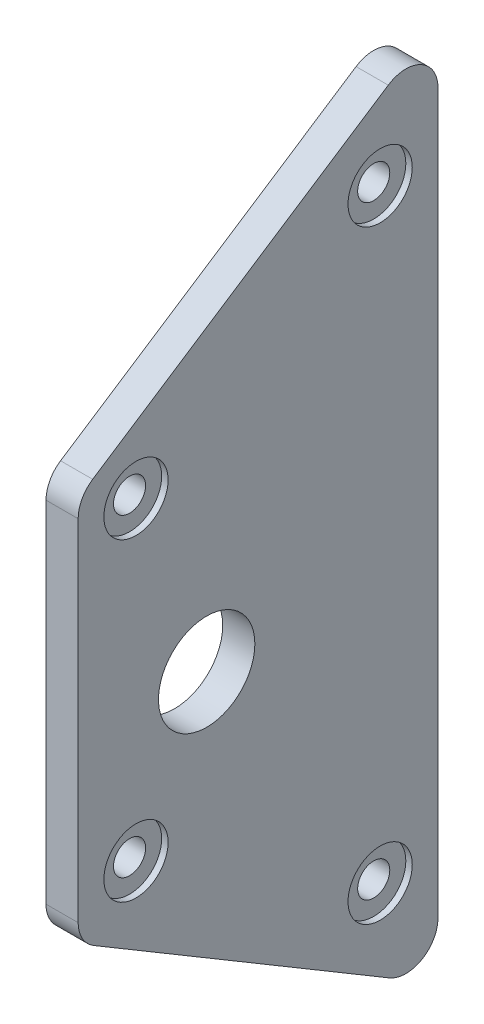
ISO-10303-21;
HEADER;
FILE_DESCRIPTION(('STEP AP214'),'2;1');
FILE_NAME('part.step','',(''),(''),'','','');
FILE_SCHEMA(('AUTOMOTIVE_DESIGN { 1 0 10303 214 1 1 1 1 }'));
ENDSEC;
DATA;
#1=APPLICATION_CONTEXT('core data for automotive mechanical design processes');
#2=APPLICATION_PROTOCOL_DEFINITION('international standard','automotive_design',2000,#1);
#3=PRODUCT_CONTEXT('',#1,'mechanical');
#4=PRODUCT('Part','Part','',(#3));
#5=PRODUCT_RELATED_PRODUCT_CATEGORY('part','',(#4));
#6=PRODUCT_DEFINITION_FORMATION('','',#4);
#7=PRODUCT_DEFINITION_CONTEXT('part definition',#1,'design');
#8=PRODUCT_DEFINITION('design','',#6,#7);
#9=PRODUCT_DEFINITION_SHAPE('','',#8);
#10=(LENGTH_UNIT() NAMED_UNIT(*) SI_UNIT(.MILLI.,.METRE.));
#11=(NAMED_UNIT(*) PLANE_ANGLE_UNIT() SI_UNIT($,.RADIAN.));
#12=(NAMED_UNIT(*) SI_UNIT($,.STERADIAN.) SOLID_ANGLE_UNIT());
#13=UNCERTAINTY_MEASURE_WITH_UNIT(LENGTH_MEASURE(1.E-05),#10,'distance_accuracy_value','');
#14=(GEOMETRIC_REPRESENTATION_CONTEXT(3) GLOBAL_UNCERTAINTY_ASSIGNED_CONTEXT((#13)) GLOBAL_UNIT_ASSIGNED_CONTEXT((#10,
#11,#12)) REPRESENTATION_CONTEXT('',''));
#15=CARTESIAN_POINT('',(0.,0.,0.));
#16=DIRECTION('',(0.,0.,1.));
#17=DIRECTION('',(1.,0.,0.));
#18=AXIS2_PLACEMENT_3D('',#15,#16,#17);
#19=CARTESIAN_POINT('',(6.35,59.69,-29.1194007412953));
#20=DIRECTION('',(-1.,0.,0.));
#21=DIRECTION('',(0.,0.,1.));
#22=AXIS2_PLACEMENT_3D('',#19,#20,#21);
#23=CYLINDRICAL_SURFACE('',#22,3.175);
#24=CARTESIAN_POINT('',(0.,59.69,-29.1194007412953));
#25=DIRECTION('',(1.,0.,0.));
#26=DIRECTION('',(0.,0.,-1.));
#27=AXIS2_PLACEMENT_3D('',#24,#25,#26);
#28=CIRCLE('',#27,3.175);
#29=CARTESIAN_POINT('',(0.,59.69,-32.2944007412953));
#30=VERTEX_POINT('',#29);
#31=EDGE_CURVE('E187',#30,#30,#28,.T.);
#32=ORIENTED_EDGE('',*,*,#31,.F.);
#33=EDGE_LOOP('',(#32));
#34=FACE_BOUND('',#33,.T.);
#35=CARTESIAN_POINT('',(5.08,59.69,-29.1194007412953));
#36=DIRECTION('',(1.,0.,0.));
#37=DIRECTION('',(0.,0.,-1.));
#38=AXIS2_PLACEMENT_3D('',#35,#36,#37);
#39=CIRCLE('',#38,3.175);
#40=CARTESIAN_POINT('',(5.08,59.69,-32.2944007412953));
#41=VERTEX_POINT('',#40);
#42=EDGE_CURVE('E153',#41,#41,#39,.T.);
#43=ORIENTED_EDGE('',*,*,#42,.T.);
#44=EDGE_LOOP('',(#43));
#45=FACE_BOUND('',#44,.T.);
#46=ADVANCED_FACE('F41',(#34,#45),#23,.F.);
#47=CARTESIAN_POINT('',(6.35,30.2927326221276,19.1405992587047));
#48=DIRECTION('',(-1.,0.,0.));
#49=DIRECTION('',(0.,0.,1.));
#50=AXIS2_PLACEMENT_3D('',#47,#48,#49);
#51=CYLINDRICAL_SURFACE('',#50,3.175);
#52=CARTESIAN_POINT('',(0.,30.2927326221276,19.1405992587047));
#53=DIRECTION('',(1.,0.,0.));
#54=DIRECTION('',(0.,0.,-1.));
#55=AXIS2_PLACEMENT_3D('',#52,#53,#54);
#56=CIRCLE('',#55,3.175);
#57=CARTESIAN_POINT('',(0.,30.2927326221276,15.9655992587047));
#58=VERTEX_POINT('',#57);
#59=EDGE_CURVE('E186',#58,#58,#56,.T.);
#60=ORIENTED_EDGE('',*,*,#59,.F.);
#61=EDGE_LOOP('',(#60));
#62=FACE_BOUND('',#61,.T.);
#63=CARTESIAN_POINT('',(5.08,30.2927326221276,19.1405992587047));
#64=DIRECTION('',(1.,0.,0.));
#65=DIRECTION('',(0.,0.,-1.));
#66=AXIS2_PLACEMENT_3D('',#63,#64,#65);
#67=CIRCLE('',#66,3.175);
#68=CARTESIAN_POINT('',(5.08,30.2927326221276,15.9655992587047));
#69=VERTEX_POINT('',#68);
#70=EDGE_CURVE('E147',#69,#69,#67,.T.);
#71=ORIENTED_EDGE('',*,*,#70,.T.);
#72=EDGE_LOOP('',(#71));
#73=FACE_BOUND('',#72,.T.);
#74=ADVANCED_FACE('F263',(#62,#73),#51,.F.);
#75=CARTESIAN_POINT('',(6.35,-59.69,-29.1194007412953));
#76=DIRECTION('',(-1.,0.,0.));
#77=DIRECTION('',(0.,0.,1.));
#78=AXIS2_PLACEMENT_3D('',#75,#76,#77);
#79=CYLINDRICAL_SURFACE('',#78,3.175);
#80=CARTESIAN_POINT('',(0.,-59.69,-29.1194007412953));
#81=DIRECTION('',(1.,0.,0.));
#82=DIRECTION('',(0.,0.,-1.));
#83=AXIS2_PLACEMENT_3D('',#80,#81,#82);
#84=CIRCLE('',#83,3.175);
#85=CARTESIAN_POINT('',(0.,-59.69,-32.2944007412953));
#86=VERTEX_POINT('',#85);
#87=EDGE_CURVE('E200',#86,#86,#84,.T.);
#88=ORIENTED_EDGE('',*,*,#87,.F.);
#89=EDGE_LOOP('',(#88));
#90=FACE_BOUND('',#89,.T.);
#91=CARTESIAN_POINT('',(5.08,-59.69,-29.1194007412953));
#92=DIRECTION('',(1.,0.,0.));
#93=DIRECTION('',(0.,0.,-1.));
#94=AXIS2_PLACEMENT_3D('',#91,#92,#93);
#95=CIRCLE('',#94,3.175);
#96=CARTESIAN_POINT('',(5.08,-59.69,-32.2944007412953));
#97=VERTEX_POINT('',#96);
#98=EDGE_CURVE('E148',#97,#97,#95,.T.);
#99=ORIENTED_EDGE('',*,*,#98,.T.);
#100=EDGE_LOOP('',(#99));
#101=FACE_BOUND('',#100,.T.);
#102=ADVANCED_FACE('F267',(#90,#101),#79,.F.);
#103=CARTESIAN_POINT('',(6.35,-31.75,19.1405992587047));
#104=DIRECTION('',(-1.,0.,0.));
#105=DIRECTION('',(0.,0.,1.));
#106=AXIS2_PLACEMENT_3D('',#103,#104,#105);
#107=CYLINDRICAL_SURFACE('',#106,3.175);
#108=CARTESIAN_POINT('',(0.,-31.75,19.1405992587047));
#109=DIRECTION('',(1.,0.,0.));
#110=DIRECTION('',(0.,0.,-1.));
#111=AXIS2_PLACEMENT_3D('',#108,#109,#110);
#112=CIRCLE('',#111,3.175);
#113=CARTESIAN_POINT('',(0.,-31.75,15.9655992587047));
#114=VERTEX_POINT('',#113);
#115=EDGE_CURVE('E205',#114,#114,#112,.T.);
#116=ORIENTED_EDGE('',*,*,#115,.F.);
#117=EDGE_LOOP('',(#116));
#118=FACE_BOUND('',#117,.T.);
#119=CARTESIAN_POINT('',(5.08,-31.75,19.1405992587047));
#120=DIRECTION('',(1.,0.,0.));
#121=DIRECTION('',(0.,0.,-1.));
#122=AXIS2_PLACEMENT_3D('',#119,#120,#121);
#123=CIRCLE('',#122,3.175);
#124=CARTESIAN_POINT('',(5.08,-31.75,15.9655992587047));
#125=VERTEX_POINT('',#124);
#126=EDGE_CURVE('E141',#125,#125,#123,.T.);
#127=ORIENTED_EDGE('',*,*,#126,.T.);
#128=EDGE_LOOP('',(#127));
#129=FACE_BOUND('',#128,.T.);
#130=ADVANCED_FACE('F239',(#118,#129),#107,.F.);
#131=CARTESIAN_POINT('',(6.35,0.,0.));
#132=DIRECTION('',(1.,0.,0.));
#133=DIRECTION('',(0.,0.,-1.));
#134=AXIS2_PLACEMENT_3D('',#131,#132,#133);
#135=PLANE('',#134);
#136=CARTESIAN_POINT('',(6.35,-59.69,-29.1194007412953));
#137=DIRECTION('',(1.,0.,0.));
#138=DIRECTION('',(0.,0.,-1.));
#139=AXIS2_PLACEMENT_3D('',#136,#137,#138);
#140=CIRCLE('',#139,6.35);
#141=CARTESIAN_POINT('',(6.35,-59.69,-35.4694007412953));
#142=VERTEX_POINT('',#141);
#143=EDGE_CURVE('E218',#142,#142,#140,.T.);
#144=ORIENTED_EDGE('',*,*,#143,.F.);
#145=EDGE_LOOP('',(#144));
#146=FACE_BOUND('',#145,.T.);
#147=CARTESIAN_POINT('',(6.35,-31.75,19.1405992587047));
#148=DIRECTION('',(1.,0.,0.));
#149=DIRECTION('',(0.,0.,-1.));
#150=AXIS2_PLACEMENT_3D('',#147,#148,#149);
#151=CIRCLE('',#150,6.35);
#152=CARTESIAN_POINT('',(6.35,-31.75,12.7905992587047));
#153=VERTEX_POINT('',#152);
#154=EDGE_CURVE('E223',#153,#153,#151,.T.);
#155=ORIENTED_EDGE('',*,*,#154,.F.);
#156=EDGE_LOOP('',(#155));
#157=FACE_BOUND('',#156,.T.);
#158=CARTESIAN_POINT('',(6.35,59.69,-29.1194007412953));
#159=DIRECTION('',(1.,0.,0.));
#160=DIRECTION('',(0.,0.,-1.));
#161=AXIS2_PLACEMENT_3D('',#158,#159,#160);
#162=CIRCLE('',#161,6.35);
#163=CARTESIAN_POINT('',(6.35,59.69,-35.4694007412953));
#164=VERTEX_POINT('',#163);
#165=EDGE_CURVE('E213',#164,#164,#162,.T.);
#166=ORIENTED_EDGE('',*,*,#165,.F.);
#167=EDGE_LOOP('',(#166));
#168=FACE_BOUND('',#167,.T.);
#169=CARTESIAN_POINT('',(6.35,30.2927326221276,19.1405992587047));
#170=DIRECTION('',(1.,0.,0.));
#171=DIRECTION('',(0.,0.,-1.));
#172=AXIS2_PLACEMENT_3D('',#169,#170,#171);
#173=CIRCLE('',#172,6.35);
#174=CARTESIAN_POINT('',(6.35,30.2927326221276,12.7905992587047));
#175=VERTEX_POINT('',#174);
#176=EDGE_CURVE('E209',#175,#175,#173,.T.);
#177=ORIENTED_EDGE('',*,*,#176,.F.);
#178=EDGE_LOOP('',(#177));
#179=FACE_BOUND('',#178,.T.);
#180=DIRECTION('',(0.,-0.511315038372004,-0.859393350878767));
#181=VECTOR('',#180,1.);
#182=CARTESIAN_POINT('',(6.35,-40.2355865921788,30.5705992587047));
#183=LINE('',#182,#181);
#184=CARTESIAN_POINT('',(6.35,-42.081873868296,27.467449752367));
#185=VERTEX_POINT('',#184);
#186=CARTESIAN_POINT('',(6.35,-76.8401420247205,-30.952550247633));
#187=VERTEX_POINT('',#186);
#188=EDGE_CURVE('E192',#185,#187,#183,.T.);
#189=ORIENTED_EDGE('',*,*,#188,.T.);
#190=CARTESIAN_POINT('',(6.35,-71.3829942466404,-34.1994007412952));
#191=DIRECTION('',(1.,0.,0.));
#192=DIRECTION('',(0.,0.,-1.));
#193=AXIS2_PLACEMENT_3D('',#190,#191,#192);
#194=CIRCLE('',#193,6.35);
#195=CARTESIAN_POINT('',(6.35,-71.3829942466404,-40.5494007412952));
#196=VERTEX_POINT('',#195);
#197=EDGE_CURVE('E168',#187,#196,#194,.T.);
#198=ORIENTED_EDGE('',*,*,#197,.T.);
#199=DIRECTION('',(0.,1.,0.));
#200=VECTOR('',#199,1.);
#201=CARTESIAN_POINT('',(6.35,-82.55,-40.5494007412952));
#202=LINE('',#201,#200);
#203=CARTESIAN_POINT('',(6.35,70.799568997581,-40.5494007412953));
#204=VERTEX_POINT('',#203);
#205=EDGE_CURVE('E130',#196,#204,#202,.T.);
#206=ORIENTED_EDGE('',*,*,#205,.T.);
#207=CARTESIAN_POINT('',(6.35,70.799568997581,-34.1994007412953));
#208=DIRECTION('',(1.,0.,0.));
#209=DIRECTION('',(0.,0.,-1.));
#210=AXIS2_PLACEMENT_3D('',#207,#208,#209);
#211=CIRCLE('',#210,6.35);
#212=CARTESIAN_POINT('',(6.35,76.111448951194,-30.7199709951437));
#213=VERTEX_POINT('',#212);
#214=EDGE_CURVE('E164',#204,#213,#211,.T.);
#215=ORIENTED_EDGE('',*,*,#214,.T.);
#216=DIRECTION('',(0.,-0.54794169230733,0.836516528128034));
#217=VECTOR('',#216,1.);
#218=CARTESIAN_POINT('',(6.35,82.55,-40.5494007412953));
#219=LINE('',#218,#217);
#220=CARTESIAN_POINT('',(6.35,37.8447171076186,27.7000290048563));
#221=VERTEX_POINT('',#220);
#222=EDGE_CURVE('E131',#213,#221,#219,.T.);
#223=ORIENTED_EDGE('',*,*,#222,.T.);
#224=CARTESIAN_POINT('',(6.35,32.5328371540056,24.2205992587047));
#225=DIRECTION('',(1.,0.,0.));
#226=DIRECTION('',(0.,0.,-1.));
#227=AXIS2_PLACEMENT_3D('',#224,#225,#226);
#228=CIRCLE('',#227,6.35);
#229=CARTESIAN_POINT('',(6.35,32.5328371540056,30.5705992587047));
#230=VERTEX_POINT('',#229);
#231=EDGE_CURVE('E64',#221,#230,#228,.T.);
#232=ORIENTED_EDGE('',*,*,#231,.T.);
#233=DIRECTION('',(0.,-1.,0.));
#234=VECTOR('',#233,1.);
#235=CARTESIAN_POINT('',(6.35,35.9644134078212,30.5705992587047));
#236=LINE('',#235,#234);
#237=CARTESIAN_POINT('',(6.35,-36.6247260902157,30.5705992587047));
#238=VERTEX_POINT('',#237);
#239=EDGE_CURVE('E140',#230,#238,#236,.T.);
#240=ORIENTED_EDGE('',*,*,#239,.T.);
#241=CARTESIAN_POINT('',(6.35,-36.6247260902158,24.2205992587047));
#242=DIRECTION('',(1.,0.,0.));
#243=DIRECTION('',(0.,0.,-1.));
#244=AXIS2_PLACEMENT_3D('',#241,#242,#243);
#245=CIRCLE('',#244,6.35);
#246=EDGE_CURVE('E169',#238,#185,#245,.T.);
#247=ORIENTED_EDGE('',*,*,#246,.T.);
#248=EDGE_LOOP('',(#189,#198,#206,#215,#223,#232,#240,#247));
#249=FACE_BOUND('',#248,.T.);
#250=CARTESIAN_POINT('',(6.35,-6.35,5.17059925870473));
#251=DIRECTION('',(1.,0.,0.));
#252=DIRECTION('',(0.,0.,-1.));
#253=AXIS2_PLACEMENT_3D('',#250,#251,#252);
#254=CIRCLE('',#253,9.525);
#255=CARTESIAN_POINT('',(6.35,-6.35,-4.35440074129527));
#256=VERTEX_POINT('',#255);
#257=EDGE_CURVE('E202',#256,#256,#254,.T.);
#258=ORIENTED_EDGE('',*,*,#257,.F.);
#259=EDGE_LOOP('',(#258));
#260=FACE_BOUND('',#259,.T.);
#261=ADVANCED_FACE('F237',(#146,#157,#168,#179,#249,#260),#135,.T.);
#262=CARTESIAN_POINT('',(0.,0.,0.));
#263=DIRECTION('',(1.,0.,0.));
#264=DIRECTION('',(0.,0.,-1.));
#265=AXIS2_PLACEMENT_3D('',#262,#263,#264);
#266=PLANE('',#265);
#267=DIRECTION('',(0.,1.,0.));
#268=VECTOR('',#267,1.);
#269=CARTESIAN_POINT('',(0.,-82.55,-40.5494007412952));
#270=LINE('',#269,#268);
#271=CARTESIAN_POINT('',(0.,-71.3829942466404,-40.5494007412952));
#272=VERTEX_POINT('',#271);
#273=CARTESIAN_POINT('',(0.,70.799568997581,-40.5494007412953));
#274=VERTEX_POINT('',#273);
#275=EDGE_CURVE('E123',#272,#274,#270,.T.);
#276=ORIENTED_EDGE('',*,*,#275,.F.);
#277=CARTESIAN_POINT('',(0.,-71.3829942466404,-34.1994007412952));
#278=DIRECTION('',(1.,0.,0.));
#279=DIRECTION('',(0.,0.,-1.));
#280=AXIS2_PLACEMENT_3D('',#277,#278,#279);
#281=CIRCLE('',#280,6.35);
#282=CARTESIAN_POINT('',(0.,-76.8401420247205,-30.952550247633));
#283=VERTEX_POINT('',#282);
#284=EDGE_CURVE('E110',#272,#283,#281,.F.);
#285=ORIENTED_EDGE('',*,*,#284,.T.);
#286=DIRECTION('',(0.,-0.511315038372004,-0.859393350878767));
#287=VECTOR('',#286,1.);
#288=CARTESIAN_POINT('',(0.,-40.2355865921788,30.5705992587047));
#289=LINE('',#288,#287);
#290=CARTESIAN_POINT('',(0.,-42.081873868296,27.467449752367));
#291=VERTEX_POINT('',#290);
#292=EDGE_CURVE('E133',#291,#283,#289,.T.);
#293=ORIENTED_EDGE('',*,*,#292,.F.);
#294=CARTESIAN_POINT('',(0.,-36.6247260902158,24.2205992587047));
#295=DIRECTION('',(1.,0.,0.));
#296=DIRECTION('',(0.,0.,-1.));
#297=AXIS2_PLACEMENT_3D('',#294,#295,#296);
#298=CIRCLE('',#297,6.35);
#299=CARTESIAN_POINT('',(0.,-36.6247260902157,30.5705992587047));
#300=VERTEX_POINT('',#299);
#301=EDGE_CURVE('E119',#291,#300,#298,.F.);
#302=ORIENTED_EDGE('',*,*,#301,.T.);
#303=DIRECTION('',(0.,-1.,0.));
#304=VECTOR('',#303,1.);
#305=CARTESIAN_POINT('',(0.,35.9644134078212,30.5705992587047));
#306=LINE('',#305,#304);
#307=CARTESIAN_POINT('',(0.,32.5328371540056,30.5705992587047));
#308=VERTEX_POINT('',#307);
#309=EDGE_CURVE('E138',#308,#300,#306,.T.);
#310=ORIENTED_EDGE('',*,*,#309,.F.);
#311=CARTESIAN_POINT('',(0.,32.5328371540056,24.2205992587047));
#312=DIRECTION('',(1.,0.,0.));
#313=DIRECTION('',(0.,0.,-1.));
#314=AXIS2_PLACEMENT_3D('',#311,#312,#313);
#315=CIRCLE('',#314,6.35);
#316=CARTESIAN_POINT('',(0.,37.8447171076186,27.7000290048563));
#317=VERTEX_POINT('',#316);
#318=EDGE_CURVE('E157',#308,#317,#315,.F.);
#319=ORIENTED_EDGE('',*,*,#318,.T.);
#320=DIRECTION('',(0.,-0.54794169230733,0.836516528128034));
#321=VECTOR('',#320,1.);
#322=CARTESIAN_POINT('',(0.,82.55,-40.5494007412953));
#323=LINE('',#322,#321);
#324=CARTESIAN_POINT('',(0.,76.111448951194,-30.7199709951437));
#325=VERTEX_POINT('',#324);
#326=EDGE_CURVE('E182',#325,#317,#323,.T.);
#327=ORIENTED_EDGE('',*,*,#326,.F.);
#328=CARTESIAN_POINT('',(0.,70.799568997581,-34.1994007412953));
#329=DIRECTION('',(1.,0.,0.));
#330=DIRECTION('',(0.,0.,-1.));
#331=AXIS2_PLACEMENT_3D('',#328,#329,#330);
#332=CIRCLE('',#331,6.35);
#333=EDGE_CURVE('E126',#325,#274,#332,.F.);
#334=ORIENTED_EDGE('',*,*,#333,.T.);
#335=EDGE_LOOP('',(#276,#285,#293,#302,#310,#319,#327,#334));
#336=FACE_BOUND('',#335,.T.);
#337=ORIENTED_EDGE('',*,*,#31,.T.);
#338=EDGE_LOOP('',(#337));
#339=FACE_BOUND('',#338,.T.);
#340=ORIENTED_EDGE('',*,*,#59,.T.);
#341=EDGE_LOOP('',(#340));
#342=FACE_BOUND('',#341,.T.);
#343=ORIENTED_EDGE('',*,*,#87,.T.);
#344=EDGE_LOOP('',(#343));
#345=FACE_BOUND('',#344,.T.);
#346=ORIENTED_EDGE('',*,*,#115,.T.);
#347=EDGE_LOOP('',(#346));
#348=FACE_BOUND('',#347,.T.);
#349=CARTESIAN_POINT('',(0.,-6.35,5.17059925870473));
#350=DIRECTION('',(1.,0.,0.));
#351=DIRECTION('',(0.,0.,-1.));
#352=AXIS2_PLACEMENT_3D('',#349,#350,#351);
#353=CIRCLE('',#352,9.525);
#354=CARTESIAN_POINT('',(0.,-6.35,-4.35440074129527));
#355=VERTEX_POINT('',#354);
#356=EDGE_CURVE('E156',#355,#355,#353,.T.);
#357=ORIENTED_EDGE('',*,*,#356,.T.);
#358=EDGE_LOOP('',(#357));
#359=FACE_BOUND('',#358,.T.);
#360=ADVANCED_FACE('F132',(#336,#339,#342,#345,#348,#359),#266,.F.);
#361=CARTESIAN_POINT('',(6.35,82.55,-40.5494007412953));
#362=DIRECTION('',(0.,-0.836516528128034,-0.54794169230733));
#363=DIRECTION('',(0.,0.54794169230733,-0.836516528128034));
#364=AXIS2_PLACEMENT_3D('',#361,#362,#363);
#365=PLANE('',#364);
#366=ORIENTED_EDGE('',*,*,#326,.T.);
#367=DIRECTION('',(-1.,0.,0.));
#368=VECTOR('',#367,1.);
#369=CARTESIAN_POINT('',(6.35,37.8447171076186,27.7000290048563));
#370=LINE('',#369,#368);
#371=EDGE_CURVE('E11',#317,#221,#370,.F.);
#372=ORIENTED_EDGE('',*,*,#371,.T.);
#373=ORIENTED_EDGE('',*,*,#222,.F.);
#374=DIRECTION('',(-1.,0.,0.));
#375=VECTOR('',#374,1.);
#376=CARTESIAN_POINT('',(6.35,76.111448951194,-30.7199709951437));
#377=LINE('',#376,#375);
#378=EDGE_CURVE('E47',#213,#325,#377,.T.);
#379=ORIENTED_EDGE('',*,*,#378,.T.);
#380=EDGE_LOOP('',(#366,#372,#373,#379));
#381=FACE_BOUND('',#380,.T.);
#382=ADVANCED_FACE('F179',(#381),#365,.F.);
#383=CARTESIAN_POINT('',(6.35,35.9644134078212,30.5705992587047));
#384=DIRECTION('',(0.,0.,-1.));
#385=DIRECTION('',(0.,1.,0.));
#386=AXIS2_PLACEMENT_3D('',#383,#384,#385);
#387=PLANE('',#386);
#388=ORIENTED_EDGE('',*,*,#309,.T.);
#389=DIRECTION('',(-1.,0.,0.));
#390=VECTOR('',#389,1.);
#391=CARTESIAN_POINT('',(6.35,-36.6247260902158,30.5705992587047));
#392=LINE('',#391,#390);
#393=EDGE_CURVE('E57',#300,#238,#392,.F.);
#394=ORIENTED_EDGE('',*,*,#393,.T.);
#395=ORIENTED_EDGE('',*,*,#239,.F.);
#396=DIRECTION('',(-1.,0.,0.));
#397=VECTOR('',#396,1.);
#398=CARTESIAN_POINT('',(6.35,32.5328371540056,30.5705992587047));
#399=LINE('',#398,#397);
#400=EDGE_CURVE('E175',#230,#308,#399,.T.);
#401=ORIENTED_EDGE('',*,*,#400,.T.);
#402=EDGE_LOOP('',(#388,#394,#395,#401));
#403=FACE_BOUND('',#402,.T.);
#404=ADVANCED_FACE('F259',(#403),#387,.F.);
#405=CARTESIAN_POINT('',(6.35,-40.2355865921788,30.5705992587047));
#406=DIRECTION('',(0.,0.859393350878767,-0.511315038372004));
#407=DIRECTION('',(0.,0.511315038372004,0.859393350878767));
#408=AXIS2_PLACEMENT_3D('',#405,#406,#407);
#409=PLANE('',#408);
#410=ORIENTED_EDGE('',*,*,#292,.T.);
#411=DIRECTION('',(-1.,0.,0.));
#412=VECTOR('',#411,1.);
#413=CARTESIAN_POINT('',(6.35,-76.8401420247205,-30.952550247633));
#414=LINE('',#413,#412);
#415=EDGE_CURVE('E115',#283,#187,#414,.F.);
#416=ORIENTED_EDGE('',*,*,#415,.T.);
#417=ORIENTED_EDGE('',*,*,#188,.F.);
#418=DIRECTION('',(-1.,0.,0.));
#419=VECTOR('',#418,1.);
#420=CARTESIAN_POINT('',(6.35,-42.081873868296,27.467449752367));
#421=LINE('',#420,#419);
#422=EDGE_CURVE('E120',#185,#291,#421,.T.);
#423=ORIENTED_EDGE('',*,*,#422,.T.);
#424=EDGE_LOOP('',(#410,#416,#417,#423));
#425=FACE_BOUND('',#424,.T.);
#426=ADVANCED_FACE('F350',(#425),#409,.F.);
#427=CARTESIAN_POINT('',(6.35,-82.55,-40.5494007412952));
#428=DIRECTION('',(0.,0.,1.));
#429=DIRECTION('',(0.,-1.,0.));
#430=AXIS2_PLACEMENT_3D('',#427,#428,#429);
#431=PLANE('',#430);
#432=ORIENTED_EDGE('',*,*,#205,.F.);
#433=DIRECTION('',(-1.,0.,0.));
#434=VECTOR('',#433,1.);
#435=CARTESIAN_POINT('',(6.35,-71.3829942466404,-40.5494007412952));
#436=LINE('',#435,#434);
#437=EDGE_CURVE('E112',#196,#272,#436,.T.);
#438=ORIENTED_EDGE('',*,*,#437,.T.);
#439=ORIENTED_EDGE('',*,*,#275,.T.);
#440=DIRECTION('',(-1.,0.,0.));
#441=VECTOR('',#440,1.);
#442=CARTESIAN_POINT('',(6.35,70.799568997581,-40.5494007412953));
#443=LINE('',#442,#441);
#444=EDGE_CURVE('E129',#274,#204,#443,.F.);
#445=ORIENTED_EDGE('',*,*,#444,.T.);
#446=EDGE_LOOP('',(#432,#438,#439,#445));
#447=FACE_BOUND('',#446,.T.);
#448=ADVANCED_FACE('F122',(#447),#431,.F.);
#449=CARTESIAN_POINT('',(6.35,-6.35,5.17059925870473));
#450=DIRECTION('',(-1.,0.,0.));
#451=DIRECTION('',(0.,0.,1.));
#452=AXIS2_PLACEMENT_3D('',#449,#450,#451);
#453=CYLINDRICAL_SURFACE('',#452,9.525);
#454=ORIENTED_EDGE('',*,*,#257,.T.);
#455=EDGE_LOOP('',(#454));
#456=FACE_BOUND('',#455,.T.);
#457=ORIENTED_EDGE('',*,*,#356,.F.);
#458=EDGE_LOOP('',(#457));
#459=FACE_BOUND('',#458,.T.);
#460=ADVANCED_FACE('F250',(#456,#459),#453,.F.);
#461=CARTESIAN_POINT('',(5.08,-31.75,19.1405992587047));
#462=DIRECTION('',(1.,0.,0.));
#463=DIRECTION('',(0.,0.,-1.));
#464=AXIS2_PLACEMENT_3D('',#461,#462,#463);
#465=CYLINDRICAL_SURFACE('',#464,6.35);
#466=CARTESIAN_POINT('',(5.08,-31.75,19.1405992587047));
#467=DIRECTION('',(1.,0.,0.));
#468=DIRECTION('',(0.,0.,-1.));
#469=AXIS2_PLACEMENT_3D('',#466,#467,#468);
#470=CIRCLE('',#469,6.35);
#471=CARTESIAN_POINT('',(5.08,-31.75,12.7905992587047));
#472=VERTEX_POINT('',#471);
#473=EDGE_CURVE('E225',#472,#472,#470,.T.);
#474=ORIENTED_EDGE('',*,*,#473,.F.);
#475=EDGE_LOOP('',(#474));
#476=FACE_BOUND('',#475,.T.);
#477=ORIENTED_EDGE('',*,*,#154,.T.);
#478=EDGE_LOOP('',(#477));
#479=FACE_BOUND('',#478,.T.);
#480=ADVANCED_FACE('F249',(#476,#479),#465,.F.);
#481=CARTESIAN_POINT('',(5.08,-31.75,19.1405992587047));
#482=DIRECTION('',(1.,0.,0.));
#483=DIRECTION('',(0.,0.,-1.));
#484=AXIS2_PLACEMENT_3D('',#481,#482,#483);
#485=PLANE('',#484);
#486=ORIENTED_EDGE('',*,*,#126,.F.);
#487=EDGE_LOOP('',(#486));
#488=FACE_BOUND('',#487,.T.);
#489=ORIENTED_EDGE('',*,*,#473,.T.);
#490=EDGE_LOOP('',(#489));
#491=FACE_BOUND('',#490,.T.);
#492=ADVANCED_FACE('F297',(#488,#491),#485,.T.);
#493=CARTESIAN_POINT('',(5.08,-59.69,-29.1194007412953));
#494=DIRECTION('',(1.,0.,0.));
#495=DIRECTION('',(0.,0.,-1.));
#496=AXIS2_PLACEMENT_3D('',#493,#494,#495);
#497=CYLINDRICAL_SURFACE('',#496,6.35);
#498=CARTESIAN_POINT('',(5.08,-59.69,-29.1194007412953));
#499=DIRECTION('',(1.,0.,0.));
#500=DIRECTION('',(0.,0.,-1.));
#501=AXIS2_PLACEMENT_3D('',#498,#499,#500);
#502=CIRCLE('',#501,6.35);
#503=CARTESIAN_POINT('',(5.08,-59.69,-35.4694007412953));
#504=VERTEX_POINT('',#503);
#505=EDGE_CURVE('E216',#504,#504,#502,.T.);
#506=ORIENTED_EDGE('',*,*,#505,.F.);
#507=EDGE_LOOP('',(#506));
#508=FACE_BOUND('',#507,.T.);
#509=ORIENTED_EDGE('',*,*,#143,.T.);
#510=EDGE_LOOP('',(#509));
#511=FACE_BOUND('',#510,.T.);
#512=ADVANCED_FACE('F295',(#508,#511),#497,.F.);
#513=CARTESIAN_POINT('',(5.08,-59.69,-29.1194007412953));
#514=DIRECTION('',(1.,0.,0.));
#515=DIRECTION('',(0.,0.,-1.));
#516=AXIS2_PLACEMENT_3D('',#513,#514,#515);
#517=PLANE('',#516);
#518=ORIENTED_EDGE('',*,*,#98,.F.);
#519=EDGE_LOOP('',(#518));
#520=FACE_BOUND('',#519,.T.);
#521=ORIENTED_EDGE('',*,*,#505,.T.);
#522=EDGE_LOOP('',(#521));
#523=FACE_BOUND('',#522,.T.);
#524=ADVANCED_FACE('F283',(#520,#523),#517,.T.);
#525=CARTESIAN_POINT('',(5.08,30.2927326221276,19.1405992587047));
#526=DIRECTION('',(1.,0.,0.));
#527=DIRECTION('',(0.,0.,-1.));
#528=AXIS2_PLACEMENT_3D('',#525,#526,#527);
#529=CYLINDRICAL_SURFACE('',#528,6.35);
#530=CARTESIAN_POINT('',(5.08,30.2927326221276,19.1405992587047));
#531=DIRECTION('',(1.,0.,0.));
#532=DIRECTION('',(0.,0.,-1.));
#533=AXIS2_PLACEMENT_3D('',#530,#531,#532);
#534=CIRCLE('',#533,6.35);
#535=CARTESIAN_POINT('',(5.08,30.2927326221276,12.7905992587047));
#536=VERTEX_POINT('',#535);
#537=EDGE_CURVE('E150',#536,#536,#534,.T.);
#538=ORIENTED_EDGE('',*,*,#537,.F.);
#539=EDGE_LOOP('',(#538));
#540=FACE_BOUND('',#539,.T.);
#541=ORIENTED_EDGE('',*,*,#176,.T.);
#542=EDGE_LOOP('',(#541));
#543=FACE_BOUND('',#542,.T.);
#544=ADVANCED_FACE('F282',(#540,#543),#529,.F.);
#545=CARTESIAN_POINT('',(5.08,30.2927326221276,19.1405992587047));
#546=DIRECTION('',(1.,0.,0.));
#547=DIRECTION('',(0.,0.,-1.));
#548=AXIS2_PLACEMENT_3D('',#545,#546,#547);
#549=PLANE('',#548);
#550=ORIENTED_EDGE('',*,*,#70,.F.);
#551=EDGE_LOOP('',(#550));
#552=FACE_BOUND('',#551,.T.);
#553=ORIENTED_EDGE('',*,*,#537,.T.);
#554=EDGE_LOOP('',(#553));
#555=FACE_BOUND('',#554,.T.);
#556=ADVANCED_FACE('F281',(#552,#555),#549,.T.);
#557=CARTESIAN_POINT('',(5.08,59.69,-29.1194007412953));
#558=DIRECTION('',(1.,0.,0.));
#559=DIRECTION('',(0.,0.,-1.));
#560=AXIS2_PLACEMENT_3D('',#557,#558,#559);
#561=CYLINDRICAL_SURFACE('',#560,6.35);
#562=CARTESIAN_POINT('',(5.08,59.69,-29.1194007412953));
#563=DIRECTION('',(1.,0.,0.));
#564=DIRECTION('',(0.,0.,-1.));
#565=AXIS2_PLACEMENT_3D('',#562,#563,#564);
#566=CIRCLE('',#565,6.35);
#567=CARTESIAN_POINT('',(5.08,59.69,-35.4694007412953));
#568=VERTEX_POINT('',#567);
#569=EDGE_CURVE('E229',#568,#568,#566,.T.);
#570=ORIENTED_EDGE('',*,*,#569,.F.);
#571=EDGE_LOOP('',(#570));
#572=FACE_BOUND('',#571,.T.);
#573=ORIENTED_EDGE('',*,*,#165,.T.);
#574=EDGE_LOOP('',(#573));
#575=FACE_BOUND('',#574,.T.);
#576=ADVANCED_FACE('F233',(#572,#575),#561,.F.);
#577=CARTESIAN_POINT('',(5.08,59.69,-29.1194007412953));
#578=DIRECTION('',(1.,0.,0.));
#579=DIRECTION('',(0.,0.,-1.));
#580=AXIS2_PLACEMENT_3D('',#577,#578,#579);
#581=PLANE('',#580);
#582=ORIENTED_EDGE('',*,*,#42,.F.);
#583=EDGE_LOOP('',(#582));
#584=FACE_BOUND('',#583,.T.);
#585=ORIENTED_EDGE('',*,*,#569,.T.);
#586=EDGE_LOOP('',(#585));
#587=FACE_BOUND('',#586,.T.);
#588=ADVANCED_FACE('F303',(#584,#587),#581,.T.);
#589=CARTESIAN_POINT('',(6.35,-71.3829942466404,-34.1994007412952));
#590=DIRECTION('',(-1.,0.,0.));
#591=DIRECTION('',(0.,0.,1.));
#592=AXIS2_PLACEMENT_3D('',#589,#590,#591);
#593=CYLINDRICAL_SURFACE('',#592,6.35);
#594=ORIENTED_EDGE('',*,*,#197,.F.);
#595=ORIENTED_EDGE('',*,*,#415,.F.);
#596=ORIENTED_EDGE('',*,*,#284,.F.);
#597=ORIENTED_EDGE('',*,*,#437,.F.);
#598=EDGE_LOOP('',(#594,#595,#596,#597));
#599=FACE_BOUND('',#598,.T.);
#600=ADVANCED_FACE('F109',(#599),#593,.T.);
#601=CARTESIAN_POINT('',(6.35,-36.6247260902158,24.2205992587047));
#602=DIRECTION('',(-1.,0.,0.));
#603=DIRECTION('',(0.,0.,1.));
#604=AXIS2_PLACEMENT_3D('',#601,#602,#603);
#605=CYLINDRICAL_SURFACE('',#604,6.35);
#606=ORIENTED_EDGE('',*,*,#246,.F.);
#607=ORIENTED_EDGE('',*,*,#393,.F.);
#608=ORIENTED_EDGE('',*,*,#301,.F.);
#609=ORIENTED_EDGE('',*,*,#422,.F.);
#610=EDGE_LOOP('',(#606,#607,#608,#609));
#611=FACE_BOUND('',#610,.T.);
#612=ADVANCED_FACE('F431',(#611),#605,.T.);
#613=CARTESIAN_POINT('',(6.35,32.5328371540056,24.2205992587047));
#614=DIRECTION('',(-1.,0.,0.));
#615=DIRECTION('',(0.,0.,1.));
#616=AXIS2_PLACEMENT_3D('',#613,#614,#615);
#617=CYLINDRICAL_SURFACE('',#616,6.35);
#618=ORIENTED_EDGE('',*,*,#231,.F.);
#619=ORIENTED_EDGE('',*,*,#371,.F.);
#620=ORIENTED_EDGE('',*,*,#318,.F.);
#621=ORIENTED_EDGE('',*,*,#400,.F.);
#622=EDGE_LOOP('',(#618,#619,#620,#621));
#623=FACE_BOUND('',#622,.T.);
#624=ADVANCED_FACE('F438',(#623),#617,.T.);
#625=CARTESIAN_POINT('',(6.35,70.799568997581,-34.1994007412953));
#626=DIRECTION('',(-1.,0.,0.));
#627=DIRECTION('',(0.,0.,1.));
#628=AXIS2_PLACEMENT_3D('',#625,#626,#627);
#629=CYLINDRICAL_SURFACE('',#628,6.35);
#630=ORIENTED_EDGE('',*,*,#214,.F.);
#631=ORIENTED_EDGE('',*,*,#444,.F.);
#632=ORIENTED_EDGE('',*,*,#333,.F.);
#633=ORIENTED_EDGE('',*,*,#378,.F.);
#634=EDGE_LOOP('',(#630,#631,#632,#633));
#635=FACE_BOUND('',#634,.T.);
#636=ADVANCED_FACE('F43',(#635),#629,.T.);
#637=CLOSED_SHELL('',(#46,#74,#102,#130,#261,#360,#382,#404,#426,#448,#460,#480,#492,#512,#524,
#544,#556,#576,#588,#600,#612,#624,#636));
#638=MANIFOLD_SOLID_BREP('B2',#637);
#639=ADVANCED_BREP_SHAPE_REPRESENTATION('',(#18,#638),#14);
#640=SHAPE_DEFINITION_REPRESENTATION(#9,#639);
ENDSEC;
END-ISO-10303-21;
